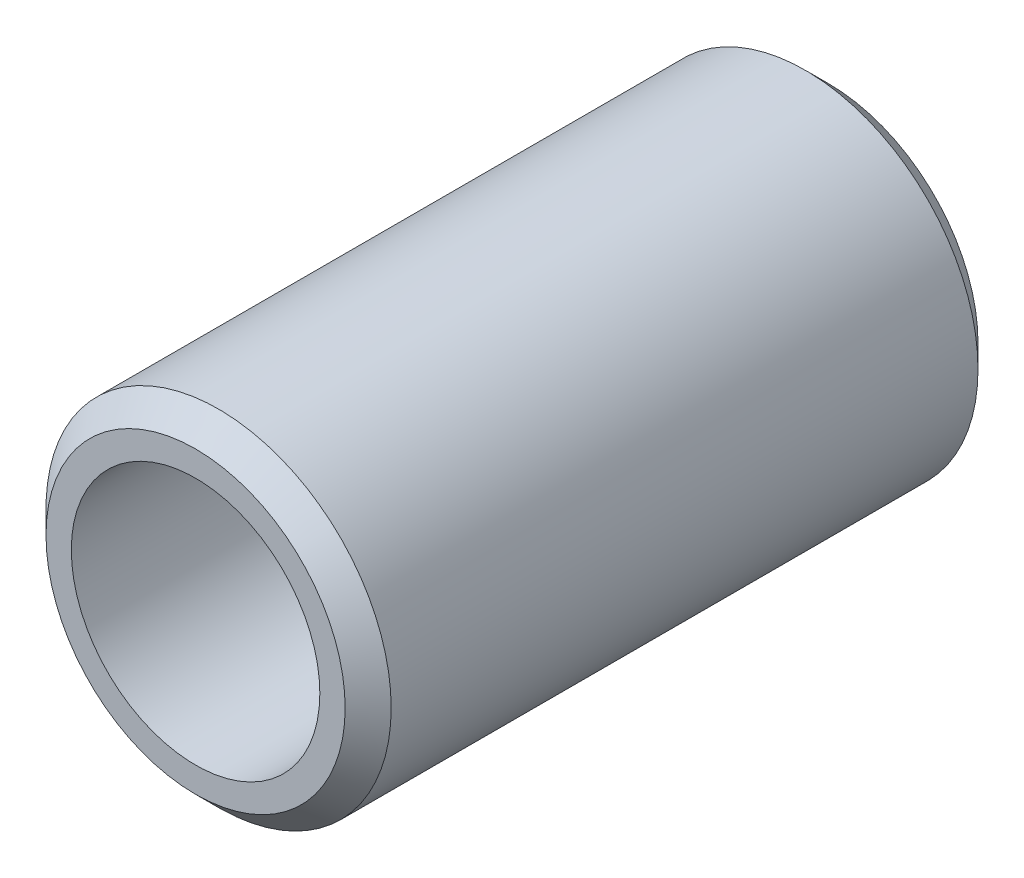
ISO-10303-21;
HEADER;
FILE_DESCRIPTION(('STEP AP214'),'2;1');
FILE_NAME('part.step','',(''),(''),'','','');
FILE_SCHEMA(('AUTOMOTIVE_DESIGN { 1 0 10303 214 1 1 1 1 }'));
ENDSEC;
DATA;
#1=APPLICATION_CONTEXT('core data for automotive mechanical design processes');
#2=APPLICATION_PROTOCOL_DEFINITION('international standard','automotive_design',2000,#1);
#3=PRODUCT_CONTEXT('',#1,'mechanical');
#4=PRODUCT('Part','Part','',(#3));
#5=PRODUCT_RELATED_PRODUCT_CATEGORY('part','',(#4));
#6=PRODUCT_DEFINITION_FORMATION('','',#4);
#7=PRODUCT_DEFINITION_CONTEXT('part definition',#1,'design');
#8=PRODUCT_DEFINITION('design','',#6,#7);
#9=PRODUCT_DEFINITION_SHAPE('','',#8);
#10=(LENGTH_UNIT() NAMED_UNIT(*) SI_UNIT(.MILLI.,.METRE.));
#11=(NAMED_UNIT(*) PLANE_ANGLE_UNIT() SI_UNIT($,.RADIAN.));
#12=(NAMED_UNIT(*) SI_UNIT($,.STERADIAN.) SOLID_ANGLE_UNIT());
#13=UNCERTAINTY_MEASURE_WITH_UNIT(LENGTH_MEASURE(1.E-05),#10,'distance_accuracy_value','');
#14=(GEOMETRIC_REPRESENTATION_CONTEXT(3) GLOBAL_UNCERTAINTY_ASSIGNED_CONTEXT((#13)) GLOBAL_UNIT_ASSIGNED_CONTEXT((#10,
#11,#12)) REPRESENTATION_CONTEXT('',''));
#15=CARTESIAN_POINT('',(0.,0.,0.));
#16=DIRECTION('',(0.,0.,1.));
#17=DIRECTION('',(1.,0.,0.));
#18=AXIS2_PLACEMENT_3D('',#15,#16,#17);
#19=CARTESIAN_POINT('',(0.,0.,17.4625));
#20=DIRECTION('',(0.,0.,1.));
#21=DIRECTION('',(1.,0.,0.));
#22=AXIS2_PLACEMENT_3D('',#19,#20,#21);
#23=PLANE('',#22);
#24=CARTESIAN_POINT('',(0.,0.,17.4625));
#25=DIRECTION('',(0.,0.,1.));
#26=DIRECTION('',(1.,0.,0.));
#27=AXIS2_PLACEMENT_3D('',#24,#25,#26);
#28=CIRCLE('',#27,8.25500000000001);
#29=CARTESIAN_POINT('',(8.25500000000001,0.,17.4625));
#30=VERTEX_POINT('',#29);
#31=EDGE_CURVE('E62',#30,#30,#28,.T.);
#32=ORIENTED_EDGE('',*,*,#31,.T.);
#33=EDGE_LOOP('',(#32));
#34=FACE_BOUND('',#33,.T.);
#35=CARTESIAN_POINT('',(0.,0.,17.4625));
#36=DIRECTION('',(0.,0.,1.));
#37=DIRECTION('',(1.,0.,0.));
#38=AXIS2_PLACEMENT_3D('',#35,#36,#37);
#39=CIRCLE('',#38,6.858);
#40=CARTESIAN_POINT('',(6.858,0.,17.4625));
#41=VERTEX_POINT('',#40);
#42=EDGE_CURVE('E68',#41,#41,#39,.T.);
#43=ORIENTED_EDGE('',*,*,#42,.F.);
#44=EDGE_LOOP('',(#43));
#45=FACE_BOUND('',#44,.T.);
#46=ADVANCED_FACE('F43',(#34,#45),#23,.T.);
#47=CARTESIAN_POINT('',(0.,0.,-17.4625));
#48=DIRECTION('',(0.,0.,1.));
#49=DIRECTION('',(1.,0.,0.));
#50=AXIS2_PLACEMENT_3D('',#47,#48,#49);
#51=PLANE('',#50);
#52=CARTESIAN_POINT('',(0.,0.,-17.4625));
#53=DIRECTION('',(0.,0.,1.));
#54=DIRECTION('',(1.,0.,0.));
#55=AXIS2_PLACEMENT_3D('',#52,#53,#54);
#56=CIRCLE('',#55,8.25499999999998);
#57=CARTESIAN_POINT('',(8.25499999999998,0.,-17.4625));
#58=VERTEX_POINT('',#57);
#59=EDGE_CURVE('E10',#58,#58,#56,.F.);
#60=ORIENTED_EDGE('',*,*,#59,.T.);
#61=EDGE_LOOP('',(#60));
#62=FACE_BOUND('',#61,.T.);
#63=CARTESIAN_POINT('',(0.,0.,-17.4625));
#64=DIRECTION('',(0.,0.,1.));
#65=DIRECTION('',(1.,0.,0.));
#66=AXIS2_PLACEMENT_3D('',#63,#64,#65);
#67=CIRCLE('',#66,6.858);
#68=CARTESIAN_POINT('',(6.858,0.,-17.4625));
#69=VERTEX_POINT('',#68);
#70=EDGE_CURVE('E69',#69,#69,#67,.T.);
#71=ORIENTED_EDGE('',*,*,#70,.T.);
#72=EDGE_LOOP('',(#71));
#73=FACE_BOUND('',#72,.T.);
#74=ADVANCED_FACE('F81',(#62,#73),#51,.F.);
#75=CARTESIAN_POINT('',(0.,0.,17.4625));
#76=DIRECTION('',(0.,0.,-1.));
#77=DIRECTION('',(-1.,0.,0.));
#78=AXIS2_PLACEMENT_3D('',#75,#76,#77);
#79=CYLINDRICAL_SURFACE('',#78,9.525);
#80=CARTESIAN_POINT('',(0.,0.,16.1925));
#81=DIRECTION('',(0.,0.,1.));
#82=DIRECTION('',(1.,0.,0.));
#83=AXIS2_PLACEMENT_3D('',#80,#81,#82);
#84=CIRCLE('',#83,9.525);
#85=CARTESIAN_POINT('',(9.525,0.,16.1925));
#86=VERTEX_POINT('',#85);
#87=EDGE_CURVE('E52',#86,#86,#84,.F.);
#88=ORIENTED_EDGE('',*,*,#87,.T.);
#89=EDGE_LOOP('',(#88));
#90=FACE_BOUND('',#89,.T.);
#91=CARTESIAN_POINT('',(0.,0.,-16.1925));
#92=DIRECTION('',(0.,0.,1.));
#93=DIRECTION('',(1.,0.,0.));
#94=AXIS2_PLACEMENT_3D('',#91,#92,#93);
#95=CIRCLE('',#94,9.525);
#96=CARTESIAN_POINT('',(9.525,0.,-16.1925));
#97=VERTEX_POINT('',#96);
#98=EDGE_CURVE('E57',#97,#97,#95,.T.);
#99=ORIENTED_EDGE('',*,*,#98,.T.);
#100=EDGE_LOOP('',(#99));
#101=FACE_BOUND('',#100,.T.);
#102=ADVANCED_FACE('F87',(#90,#101),#79,.T.);
#103=CARTESIAN_POINT('',(0.,0.,17.4625));
#104=DIRECTION('',(0.,0.,-1.));
#105=DIRECTION('',(-1.,0.,0.));
#106=AXIS2_PLACEMENT_3D('',#103,#104,#105);
#107=CYLINDRICAL_SURFACE('',#106,6.858);
#108=ORIENTED_EDGE('',*,*,#42,.T.);
#109=EDGE_LOOP('',(#108));
#110=FACE_BOUND('',#109,.T.);
#111=ORIENTED_EDGE('',*,*,#70,.F.);
#112=EDGE_LOOP('',(#111));
#113=FACE_BOUND('',#112,.T.);
#114=ADVANCED_FACE('F77',(#110,#113),#107,.F.);
#115=CARTESIAN_POINT('',(0.,0.,17.4625));
#116=DIRECTION('',(0.,0.,-1.));
#117=DIRECTION('',(-1.,0.,0.));
#118=AXIS2_PLACEMENT_3D('',#115,#116,#117);
#119=CONICAL_SURFACE('',#118,8.25500000000001,0.785398163397446);
#120=ORIENTED_EDGE('',*,*,#87,.F.);
#121=EDGE_LOOP('',(#120));
#122=FACE_BOUND('',#121,.T.);
#123=ORIENTED_EDGE('',*,*,#31,.F.);
#124=EDGE_LOOP('',(#123));
#125=FACE_BOUND('',#124,.T.);
#126=ADVANCED_FACE('F93',(#122,#125),#119,.T.);
#127=CARTESIAN_POINT('',(0.,0.,-16.1925));
#128=DIRECTION('',(0.,0.,1.));
#129=DIRECTION('',(1.,0.,0.));
#130=AXIS2_PLACEMENT_3D('',#127,#128,#129);
#131=CONICAL_SURFACE('',#130,9.525,0.785398163397449);
#132=ORIENTED_EDGE('',*,*,#59,.F.);
#133=EDGE_LOOP('',(#132));
#134=FACE_BOUND('',#133,.T.);
#135=ORIENTED_EDGE('',*,*,#98,.F.);
#136=EDGE_LOOP('',(#135));
#137=FACE_BOUND('',#136,.T.);
#138=ADVANCED_FACE('F46',(#134,#137),#131,.T.);
#139=CLOSED_SHELL('',(#46,#74,#102,#114,#126,#138));
#140=MANIFOLD_SOLID_BREP('B2',#139);
#141=ADVANCED_BREP_SHAPE_REPRESENTATION('',(#18,#140),#14);
#142=SHAPE_DEFINITION_REPRESENTATION(#9,#141);
ENDSEC;
END-ISO-10303-21;
